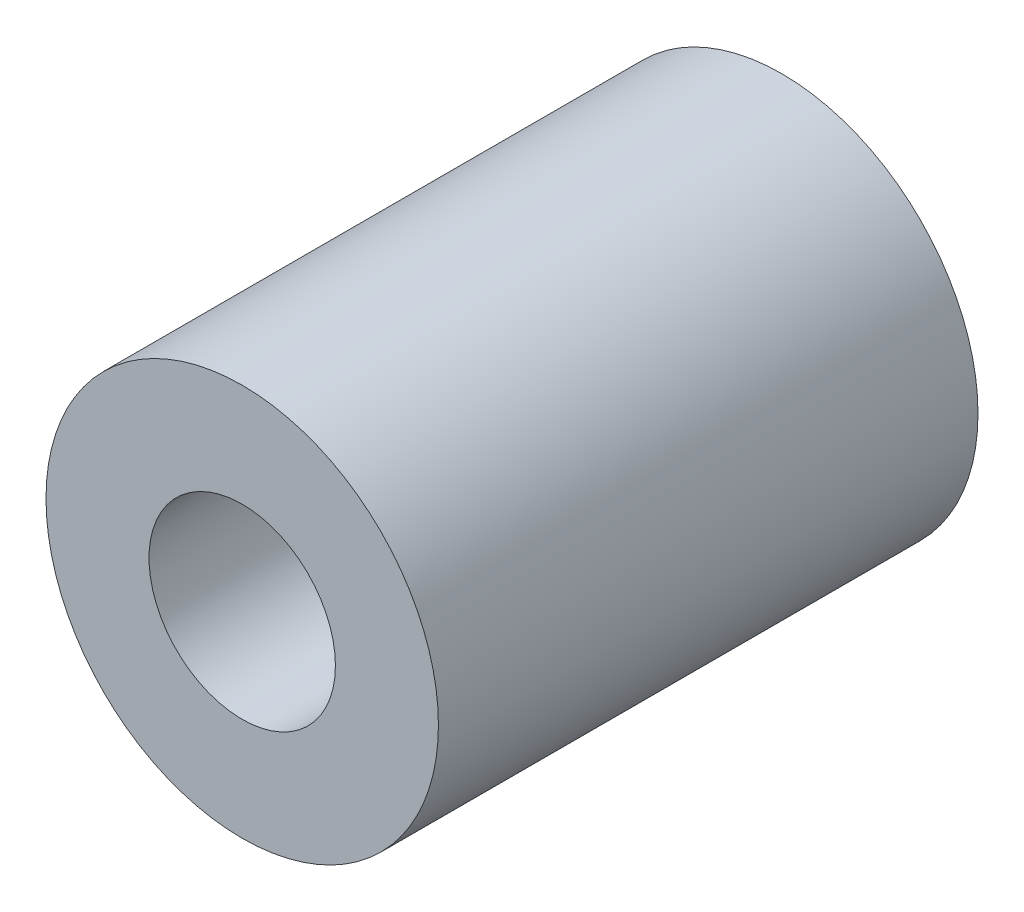
ISO-10303-21;
HEADER;
FILE_DESCRIPTION(('STEP AP214'),'2;1');
FILE_NAME('part.step','',(''),(''),'','','');
FILE_SCHEMA(('AUTOMOTIVE_DESIGN { 1 0 10303 214 1 1 1 1 }'));
ENDSEC;
DATA;
#1=APPLICATION_CONTEXT('core data for automotive mechanical design processes');
#2=APPLICATION_PROTOCOL_DEFINITION('international standard','automotive_design',2000,#1);
#3=PRODUCT_CONTEXT('',#1,'mechanical');
#4=PRODUCT('Part','Part','',(#3));
#5=PRODUCT_RELATED_PRODUCT_CATEGORY('part','',(#4));
#6=PRODUCT_DEFINITION_FORMATION('','',#4);
#7=PRODUCT_DEFINITION_CONTEXT('part definition',#1,'design');
#8=PRODUCT_DEFINITION('design','',#6,#7);
#9=PRODUCT_DEFINITION_SHAPE('','',#8);
#10=(LENGTH_UNIT() NAMED_UNIT(*) SI_UNIT(.MILLI.,.METRE.));
#11=(NAMED_UNIT(*) PLANE_ANGLE_UNIT() SI_UNIT($,.RADIAN.));
#12=(NAMED_UNIT(*) SI_UNIT($,.STERADIAN.) SOLID_ANGLE_UNIT());
#13=UNCERTAINTY_MEASURE_WITH_UNIT(LENGTH_MEASURE(1.E-05),#10,'distance_accuracy_value','');
#14=(GEOMETRIC_REPRESENTATION_CONTEXT(3) GLOBAL_UNCERTAINTY_ASSIGNED_CONTEXT((#13)) GLOBAL_UNIT_ASSIGNED_CONTEXT((#10,
#11,#12)) REPRESENTATION_CONTEXT('',''));
#15=CARTESIAN_POINT('',(0.,0.,0.));
#16=DIRECTION('',(0.,0.,1.));
#17=DIRECTION('',(1.,0.,0.));
#18=AXIS2_PLACEMENT_3D('',#15,#16,#17);
#19=CARTESIAN_POINT('',(0.,0.,7.));
#20=DIRECTION('',(0.,0.,1.));
#21=DIRECTION('',(1.,0.,0.));
#22=AXIS2_PLACEMENT_3D('',#19,#20,#21);
#23=PLANE('',#22);
#24=DIRECTION('',(0.,1.,0.));
#25=VECTOR('',#24,1.);
#26=CARTESIAN_POINT('',(1.6,2.6,7.));
#27=LINE('',#26,#25);
#28=CARTESIAN_POINT('',(1.6,1.02469507659596,7.));
#29=VERTEX_POINT('',#28);
#30=CARTESIAN_POINT('',(1.6,2.6,7.));
#31=VERTEX_POINT('',#30);
#32=EDGE_CURVE('E105',#29,#31,#27,.T.);
#33=ORIENTED_EDGE('',*,*,#32,.F.);
#34=CARTESIAN_POINT('',(0.,0.,7.));
#35=DIRECTION('',(0.,0.,1.));
#36=DIRECTION('',(1.,0.,0.));
#37=AXIS2_PLACEMENT_3D('',#34,#35,#36);
#38=CIRCLE('',#37,1.9);
#39=CARTESIAN_POINT('',(-1.6,1.02469507659596,7.));
#40=VERTEX_POINT('',#39);
#41=EDGE_CURVE('E93',#29,#40,#38,.T.);
#42=ORIENTED_EDGE('',*,*,#41,.T.);
#43=DIRECTION('',(0.,-1.,0.));
#44=VECTOR('',#43,1.);
#45=CARTESIAN_POINT('',(-1.6,0.,7.));
#46=LINE('',#45,#44);
#47=CARTESIAN_POINT('',(-1.6,2.6,7.));
#48=VERTEX_POINT('',#47);
#49=EDGE_CURVE('E119',#48,#40,#46,.T.);
#50=ORIENTED_EDGE('',*,*,#49,.F.);
#51=DIRECTION('',(-1.,0.,0.));
#52=VECTOR('',#51,1.);
#53=CARTESIAN_POINT('',(-1.6,2.6,7.));
#54=LINE('',#53,#52);
#55=EDGE_CURVE('E107',#31,#48,#54,.T.);
#56=ORIENTED_EDGE('',*,*,#55,.F.);
#57=EDGE_LOOP('',(#33,#42,#50,#56));
#58=FACE_BOUND('',#57,.T.);
#59=ADVANCED_FACE('F33',(#58),#23,.F.);
#60=CARTESIAN_POINT('',(0.,0.,0.));
#61=DIRECTION('',(0.,0.,1.));
#62=DIRECTION('',(1.,0.,0.));
#63=AXIS2_PLACEMENT_3D('',#60,#61,#62);
#64=PLANE('',#63);
#65=CARTESIAN_POINT('',(0.,0.,0.));
#66=DIRECTION('',(0.,0.,1.));
#67=DIRECTION('',(1.,0.,0.));
#68=AXIS2_PLACEMENT_3D('',#65,#66,#67);
#69=CIRCLE('',#68,4.);
#70=CARTESIAN_POINT('',(4.,0.,0.));
#71=VERTEX_POINT('',#70);
#72=EDGE_CURVE('E11',#71,#71,#69,.T.);
#73=ORIENTED_EDGE('',*,*,#72,.F.);
#74=EDGE_LOOP('',(#73));
#75=FACE_BOUND('',#74,.T.);
#76=DIRECTION('',(0.,1.,0.));
#77=VECTOR('',#76,1.);
#78=CARTESIAN_POINT('',(1.6,2.6,0.));
#79=LINE('',#78,#77);
#80=CARTESIAN_POINT('',(1.6,-2.6,0.));
#81=VERTEX_POINT('',#80);
#82=CARTESIAN_POINT('',(1.6,2.6,0.));
#83=VERTEX_POINT('',#82);
#84=EDGE_CURVE('E56',#81,#83,#79,.T.);
#85=ORIENTED_EDGE('',*,*,#84,.T.);
#86=DIRECTION('',(-1.,0.,0.));
#87=VECTOR('',#86,1.);
#88=CARTESIAN_POINT('',(-1.6,2.6,0.));
#89=LINE('',#88,#87);
#90=CARTESIAN_POINT('',(-1.6,2.6,0.));
#91=VERTEX_POINT('',#90);
#92=EDGE_CURVE('E127',#83,#91,#89,.T.);
#93=ORIENTED_EDGE('',*,*,#92,.T.);
#94=DIRECTION('',(0.,-1.,0.));
#95=VECTOR('',#94,1.);
#96=CARTESIAN_POINT('',(-1.6,-2.6,0.));
#97=LINE('',#96,#95);
#98=CARTESIAN_POINT('',(-1.6,-2.6,0.));
#99=VERTEX_POINT('',#98);
#100=EDGE_CURVE('E130',#91,#99,#97,.T.);
#101=ORIENTED_EDGE('',*,*,#100,.T.);
#102=DIRECTION('',(1.,0.,0.));
#103=VECTOR('',#102,1.);
#104=CARTESIAN_POINT('',(1.6,-2.6,0.));
#105=LINE('',#104,#103);
#106=EDGE_CURVE('E109',#99,#81,#105,.T.);
#107=ORIENTED_EDGE('',*,*,#106,.T.);
#108=EDGE_LOOP('',(#85,#93,#101,#107));
#109=FACE_BOUND('',#108,.T.);
#110=ADVANCED_FACE('F142',(#75,#109),#64,.F.);
#111=CARTESIAN_POINT('',(0.,0.,7.));
#112=DIRECTION('',(0.,0.,-1.));
#113=DIRECTION('',(-1.,0.,0.));
#114=AXIS2_PLACEMENT_3D('',#111,#112,#113);
#115=CYLINDRICAL_SURFACE('',#114,4.);
#116=ORIENTED_EDGE('',*,*,#72,.T.);
#117=EDGE_LOOP('',(#116));
#118=FACE_BOUND('',#117,.T.);
#119=CARTESIAN_POINT('',(0.,0.,11.));
#120=DIRECTION('',(0.,0.,1.));
#121=DIRECTION('',(1.,0.,0.));
#122=AXIS2_PLACEMENT_3D('',#119,#120,#121);
#123=CIRCLE('',#122,4.);
#124=CARTESIAN_POINT('',(4.,0.,11.));
#125=VERTEX_POINT('',#124);
#126=EDGE_CURVE('E103',#125,#125,#123,.T.);
#127=ORIENTED_EDGE('',*,*,#126,.F.);
#128=EDGE_LOOP('',(#127));
#129=FACE_BOUND('',#128,.T.);
#130=ADVANCED_FACE('F35',(#118,#129),#115,.T.);
#131=CARTESIAN_POINT('',(1.6,2.6,7.));
#132=DIRECTION('',(-1.,0.,0.));
#133=DIRECTION('',(0.,-1.,0.));
#134=AXIS2_PLACEMENT_3D('',#131,#132,#133);
#135=PLANE('',#134);
#136=ORIENTED_EDGE('',*,*,#84,.F.);
#137=DIRECTION('',(0.,0.,-1.));
#138=VECTOR('',#137,1.);
#139=CARTESIAN_POINT('',(1.6,-2.6,7.));
#140=LINE('',#139,#138);
#141=CARTESIAN_POINT('',(1.6,-2.6,7.));
#142=VERTEX_POINT('',#141);
#143=EDGE_CURVE('E125',#142,#81,#140,.T.);
#144=ORIENTED_EDGE('',*,*,#143,.F.);
#145=CARTESIAN_POINT('',(1.6,-1.02469507659596,7.));
#146=VERTEX_POINT('',#145);
#147=EDGE_CURVE('E111',#142,#146,#27,.T.);
#148=ORIENTED_EDGE('',*,*,#147,.T.);
#149=EDGE_CURVE('E88',#146,#29,#27,.T.);
#150=ORIENTED_EDGE('',*,*,#149,.T.);
#151=ORIENTED_EDGE('',*,*,#32,.T.);
#152=DIRECTION('',(0.,0.,-1.));
#153=VECTOR('',#152,1.);
#154=CARTESIAN_POINT('',(1.6,2.6,7.));
#155=LINE('',#154,#153);
#156=EDGE_CURVE('E41',#31,#83,#155,.T.);
#157=ORIENTED_EDGE('',*,*,#156,.T.);
#158=EDGE_LOOP('',(#136,#144,#148,#150,#151,#157));
#159=FACE_BOUND('',#158,.T.);
#160=ADVANCED_FACE('F113',(#159),#135,.T.);
#161=CARTESIAN_POINT('',(-1.6,2.6,7.));
#162=DIRECTION('',(0.,-1.,0.));
#163=DIRECTION('',(0.,0.,-1.));
#164=AXIS2_PLACEMENT_3D('',#161,#162,#163);
#165=PLANE('',#164);
#166=ORIENTED_EDGE('',*,*,#92,.F.);
#167=ORIENTED_EDGE('',*,*,#156,.F.);
#168=ORIENTED_EDGE('',*,*,#55,.T.);
#169=DIRECTION('',(0.,0.,-1.));
#170=VECTOR('',#169,1.);
#171=CARTESIAN_POINT('',(-1.6,2.6,7.));
#172=LINE('',#171,#170);
#173=EDGE_CURVE('E138',#48,#91,#172,.T.);
#174=ORIENTED_EDGE('',*,*,#173,.T.);
#175=EDGE_LOOP('',(#166,#167,#168,#174));
#176=FACE_BOUND('',#175,.T.);
#177=ADVANCED_FACE('F168',(#176),#165,.T.);
#178=CARTESIAN_POINT('',(-1.6,-2.6,7.));
#179=DIRECTION('',(1.,0.,0.));
#180=DIRECTION('',(0.,0.,-1.));
#181=AXIS2_PLACEMENT_3D('',#178,#179,#180);
#182=PLANE('',#181);
#183=ORIENTED_EDGE('',*,*,#100,.F.);
#184=ORIENTED_EDGE('',*,*,#173,.F.);
#185=ORIENTED_EDGE('',*,*,#49,.T.);
#186=CARTESIAN_POINT('',(-1.6,-1.02469507659596,7.));
#187=VERTEX_POINT('',#186);
#188=EDGE_CURVE('E122',#40,#187,#46,.T.);
#189=ORIENTED_EDGE('',*,*,#188,.T.);
#190=CARTESIAN_POINT('',(-1.6,-2.6,7.));
#191=VERTEX_POINT('',#190);
#192=EDGE_CURVE('E118',#187,#191,#46,.T.);
#193=ORIENTED_EDGE('',*,*,#192,.T.);
#194=DIRECTION('',(0.,0.,-1.));
#195=VECTOR('',#194,1.);
#196=CARTESIAN_POINT('',(-1.6,-2.6,7.));
#197=LINE('',#196,#195);
#198=EDGE_CURVE('E136',#191,#99,#197,.T.);
#199=ORIENTED_EDGE('',*,*,#198,.T.);
#200=EDGE_LOOP('',(#183,#184,#185,#189,#193,#199));
#201=FACE_BOUND('',#200,.T.);
#202=ADVANCED_FACE('F180',(#201),#182,.T.);
#203=CARTESIAN_POINT('',(1.6,-2.6,7.));
#204=DIRECTION('',(0.,1.,0.));
#205=DIRECTION('',(0.,0.,1.));
#206=AXIS2_PLACEMENT_3D('',#203,#204,#205);
#207=PLANE('',#206);
#208=ORIENTED_EDGE('',*,*,#106,.F.);
#209=ORIENTED_EDGE('',*,*,#198,.F.);
#210=DIRECTION('',(1.,0.,0.));
#211=VECTOR('',#210,1.);
#212=CARTESIAN_POINT('',(1.6,-2.6,7.));
#213=LINE('',#212,#211);
#214=EDGE_CURVE('E121',#191,#142,#213,.T.);
#215=ORIENTED_EDGE('',*,*,#214,.T.);
#216=ORIENTED_EDGE('',*,*,#143,.T.);
#217=EDGE_LOOP('',(#208,#209,#215,#216));
#218=FACE_BOUND('',#217,.T.);
#219=ADVANCED_FACE('F146',(#218),#207,.T.);
#220=ORIENTED_EDGE('',*,*,#192,.F.);
#221=EDGE_CURVE('E90',#187,#146,#38,.T.);
#222=ORIENTED_EDGE('',*,*,#221,.T.);
#223=ORIENTED_EDGE('',*,*,#147,.F.);
#224=ORIENTED_EDGE('',*,*,#214,.F.);
#225=EDGE_LOOP('',(#220,#222,#223,#224));
#226=FACE_BOUND('',#225,.T.);
#227=ADVANCED_FACE('F150',(#226),#23,.F.);
#228=CARTESIAN_POINT('',(0.,0.,11.));
#229=DIRECTION('',(0.,0.,1.));
#230=DIRECTION('',(1.,0.,0.));
#231=AXIS2_PLACEMENT_3D('',#228,#229,#230);
#232=PLANE('',#231);
#233=CARTESIAN_POINT('',(0.,0.,11.));
#234=DIRECTION('',(0.,0.,1.));
#235=DIRECTION('',(1.,0.,0.));
#236=AXIS2_PLACEMENT_3D('',#233,#234,#235);
#237=CIRCLE('',#236,1.9);
#238=CARTESIAN_POINT('',(1.9,0.,11.));
#239=VERTEX_POINT('',#238);
#240=EDGE_CURVE('E91',#239,#239,#237,.T.);
#241=ORIENTED_EDGE('',*,*,#240,.F.);
#242=EDGE_LOOP('',(#241));
#243=FACE_BOUND('',#242,.T.);
#244=ORIENTED_EDGE('',*,*,#126,.T.);
#245=EDGE_LOOP('',(#244));
#246=FACE_BOUND('',#245,.T.);
#247=ADVANCED_FACE('F155',(#243,#246),#232,.T.);
#248=CARTESIAN_POINT('',(0.,0.,7.));
#249=DIRECTION('',(0.,0.,1.));
#250=DIRECTION('',(1.,0.,0.));
#251=AXIS2_PLACEMENT_3D('',#248,#249,#250);
#252=PLANE('',#251);
#253=EDGE_CURVE('E48',#146,#29,#38,.T.);
#254=ORIENTED_EDGE('',*,*,#253,.T.);
#255=ORIENTED_EDGE('',*,*,#149,.F.);
#256=EDGE_LOOP('',(#254,#255));
#257=FACE_BOUND('',#256,.T.);
#258=ADVANCED_FACE('F86',(#257),#252,.T.);
#259=CARTESIAN_POINT('',(0.,0.,7.));
#260=DIRECTION('',(0.,0.,1.));
#261=DIRECTION('',(1.,0.,0.));
#262=AXIS2_PLACEMENT_3D('',#259,#260,#261);
#263=CYLINDRICAL_SURFACE('',#262,1.9);
#264=ORIENTED_EDGE('',*,*,#41,.F.);
#265=ORIENTED_EDGE('',*,*,#253,.F.);
#266=ORIENTED_EDGE('',*,*,#221,.F.);
#267=EDGE_CURVE('E100',#40,#187,#38,.T.);
#268=ORIENTED_EDGE('',*,*,#267,.F.);
#269=EDGE_LOOP('',(#264,#265,#266,#268));
#270=FACE_BOUND('',#269,.T.);
#271=ORIENTED_EDGE('',*,*,#240,.T.);
#272=EDGE_LOOP('',(#271));
#273=FACE_BOUND('',#272,.T.);
#274=ADVANCED_FACE('F97',(#270,#273),#263,.F.);
#275=ORIENTED_EDGE('',*,*,#267,.T.);
#276=ORIENTED_EDGE('',*,*,#188,.F.);
#277=EDGE_LOOP('',(#275,#276));
#278=FACE_BOUND('',#277,.T.);
#279=ADVANCED_FACE('F192',(#278),#252,.T.);
#280=CLOSED_SHELL('',(#59,#110,#130,#160,#177,#202,#219,#227,#247,#258,#274,#279));
#281=MANIFOLD_SOLID_BREP('B2',#280);
#282=ADVANCED_BREP_SHAPE_REPRESENTATION('',(#18,#281),#14);
#283=SHAPE_DEFINITION_REPRESENTATION(#9,#282);
ENDSEC;
END-ISO-10303-21;
